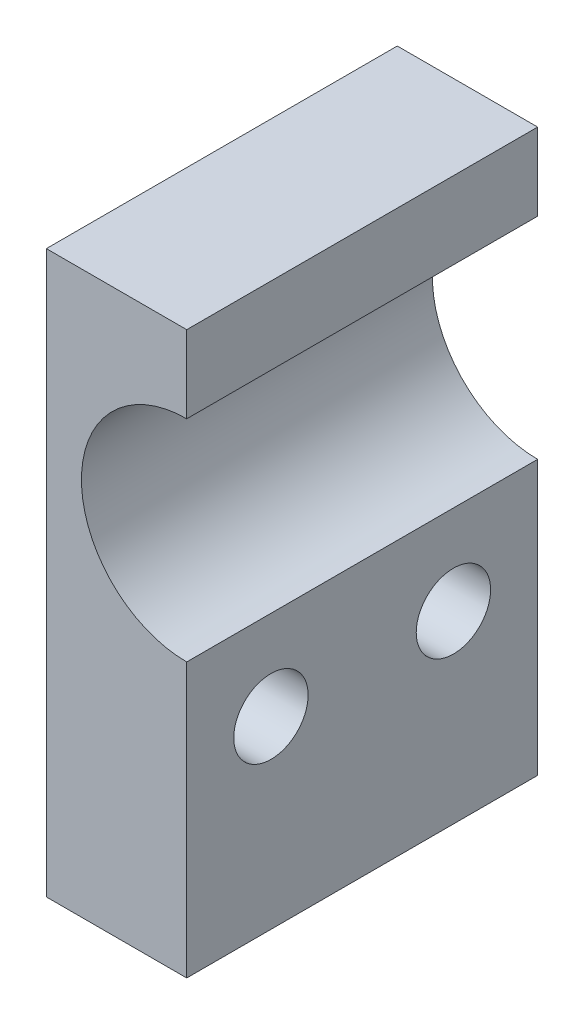
ISO-10303-21;
HEADER;
FILE_DESCRIPTION(('STEP AP214'),'2;1');
FILE_NAME('part.step','',(''),(''),'','','');
FILE_SCHEMA(('AUTOMOTIVE_DESIGN { 1 0 10303 214 1 1 1 1 }'));
ENDSEC;
DATA;
#1=APPLICATION_CONTEXT('core data for automotive mechanical design processes');
#2=APPLICATION_PROTOCOL_DEFINITION('international standard','automotive_design',2000,#1);
#3=PRODUCT_CONTEXT('',#1,'mechanical');
#4=PRODUCT('Part','Part','',(#3));
#5=PRODUCT_RELATED_PRODUCT_CATEGORY('part','',(#4));
#6=PRODUCT_DEFINITION_FORMATION('','',#4);
#7=PRODUCT_DEFINITION_CONTEXT('part definition',#1,'design');
#8=PRODUCT_DEFINITION('design','',#6,#7);
#9=PRODUCT_DEFINITION_SHAPE('','',#8);
#10=(LENGTH_UNIT() NAMED_UNIT(*) SI_UNIT(.MILLI.,.METRE.));
#11=(NAMED_UNIT(*) PLANE_ANGLE_UNIT() SI_UNIT($,.RADIAN.));
#12=(NAMED_UNIT(*) SI_UNIT($,.STERADIAN.) SOLID_ANGLE_UNIT());
#13=UNCERTAINTY_MEASURE_WITH_UNIT(LENGTH_MEASURE(1.E-05),#10,'distance_accuracy_value','');
#14=(GEOMETRIC_REPRESENTATION_CONTEXT(3) GLOBAL_UNCERTAINTY_ASSIGNED_CONTEXT((#13)) GLOBAL_UNIT_ASSIGNED_CONTEXT((#10,
#11,#12)) REPRESENTATION_CONTEXT('',''));
#15=CARTESIAN_POINT('',(0.,0.,0.));
#16=DIRECTION('',(0.,0.,1.));
#17=DIRECTION('',(1.,0.,0.));
#18=AXIS2_PLACEMENT_3D('',#15,#16,#17);
#19=CARTESIAN_POINT('',(-15.,0.,0.));
#20=DIRECTION('',(-1.,0.,0.));
#21=DIRECTION('',(0.,0.,1.));
#22=AXIS2_PLACEMENT_3D('',#19,#20,#21);
#23=PLANE('',#22);
#24=CARTESIAN_POINT('',(-15.,-6.86493963041226,19.));
#25=DIRECTION('',(-1.,0.,0.));
#26=DIRECTION('',(0.,0.,1.));
#27=AXIS2_PLACEMENT_3D('',#24,#25,#26);
#28=CIRCLE('',#27,2.65);
#29=CARTESIAN_POINT('',(-15.,-6.86493963041226,21.65));
#30=VERTEX_POINT('',#29);
#31=EDGE_CURVE('E148',#30,#30,#28,.F.);
#32=ORIENTED_EDGE('',*,*,#31,.F.);
#33=EDGE_LOOP('',(#32));
#34=FACE_BOUND('',#33,.T.);
#35=DIRECTION('',(0.,0.,-1.));
#36=VECTOR('',#35,1.);
#37=CARTESIAN_POINT('',(-15.,-20.,25.));
#38=LINE('',#37,#36);
#39=CARTESIAN_POINT('',(-15.,-20.,25.));
#40=VERTEX_POINT('',#39);
#41=CARTESIAN_POINT('',(-15.,-20.,0.));
#42=VERTEX_POINT('',#41);
#43=EDGE_CURVE('E103',#40,#42,#38,.T.);
#44=ORIENTED_EDGE('',*,*,#43,.T.);
#45=DIRECTION('',(0.,-1.,0.));
#46=VECTOR('',#45,1.);
#47=CARTESIAN_POINT('',(-15.,0.,0.));
#48=LINE('',#47,#46);
#49=CARTESIAN_POINT('',(-15.,-0.499999999999988,0.));
#50=VERTEX_POINT('',#49);
#51=EDGE_CURVE('E144',#50,#42,#48,.T.);
#52=ORIENTED_EDGE('',*,*,#51,.F.);
#53=DIRECTION('',(0.,0.,-1.));
#54=VECTOR('',#53,1.);
#55=CARTESIAN_POINT('',(-15.,-0.499999999999988,25.));
#56=LINE('',#55,#54);
#57=CARTESIAN_POINT('',(-15.,-0.499999999999988,25.));
#58=VERTEX_POINT('',#57);
#59=EDGE_CURVE('E12',#50,#58,#56,.F.);
#60=ORIENTED_EDGE('',*,*,#59,.T.);
#61=DIRECTION('',(0.,-1.,0.));
#62=VECTOR('',#61,1.);
#63=CARTESIAN_POINT('',(-15.,0.,25.));
#64=LINE('',#63,#62);
#65=EDGE_CURVE('E65',#58,#40,#64,.T.);
#66=ORIENTED_EDGE('',*,*,#65,.T.);
#67=EDGE_LOOP('',(#44,#52,#60,#66));
#68=FACE_BOUND('',#67,.T.);
#69=CARTESIAN_POINT('',(-15.,-6.86493963041226,6.));
#70=DIRECTION('',(-1.,0.,0.));
#71=DIRECTION('',(0.,0.,1.));
#72=AXIS2_PLACEMENT_3D('',#69,#70,#71);
#73=CIRCLE('',#72,2.65);
#74=CARTESIAN_POINT('',(-15.,-6.86493963041226,8.65));
#75=VERTEX_POINT('',#74);
#76=EDGE_CURVE('E44',#75,#75,#73,.F.);
#77=ORIENTED_EDGE('',*,*,#76,.F.);
#78=EDGE_LOOP('',(#77));
#79=FACE_BOUND('',#78,.T.);
#80=ADVANCED_FACE('F40',(#34,#68,#79),#23,.F.);
#81=DIRECTION('',(0.,0.,-1.));
#82=VECTOR('',#81,1.);
#83=CARTESIAN_POINT('',(-15.,14.5,25.));
#84=LINE('',#83,#82);
#85=CARTESIAN_POINT('',(-15.,14.5,25.));
#86=VERTEX_POINT('',#85);
#87=CARTESIAN_POINT('',(-15.,14.5,0.));
#88=VERTEX_POINT('',#87);
#89=EDGE_CURVE('E49',#86,#88,#84,.T.);
#90=ORIENTED_EDGE('',*,*,#89,.T.);
#91=CARTESIAN_POINT('',(-15.,20.,0.));
#92=VERTEX_POINT('',#91);
#93=EDGE_CURVE('E146',#92,#88,#48,.T.);
#94=ORIENTED_EDGE('',*,*,#93,.F.);
#95=DIRECTION('',(0.,0.,-1.));
#96=VECTOR('',#95,1.);
#97=CARTESIAN_POINT('',(-15.,20.,25.));
#98=LINE('',#97,#96);
#99=CARTESIAN_POINT('',(-15.,20.,25.));
#100=VERTEX_POINT('',#99);
#101=EDGE_CURVE('E114',#100,#92,#98,.T.);
#102=ORIENTED_EDGE('',*,*,#101,.F.);
#103=EDGE_CURVE('E57',#100,#86,#64,.T.);
#104=ORIENTED_EDGE('',*,*,#103,.T.);
#105=EDGE_LOOP('',(#90,#94,#102,#104));
#106=FACE_BOUND('',#105,.T.);
#107=ADVANCED_FACE('F42',(#106),#23,.F.);
#108=CARTESIAN_POINT('',(-22.,-6.86493963041226,19.));
#109=DIRECTION('',(-1.,0.,0.));
#110=DIRECTION('',(0.,0.,1.));
#111=AXIS2_PLACEMENT_3D('',#108,#109,#110);
#112=CYLINDRICAL_SURFACE('',#111,5.);
#113=CARTESIAN_POINT('',(-22.,-6.86493963041226,19.));
#114=DIRECTION('',(-1.,0.,0.));
#115=DIRECTION('',(0.,0.,1.));
#116=AXIS2_PLACEMENT_3D('',#113,#114,#115);
#117=CIRCLE('',#116,5.);
#118=CARTESIAN_POINT('',(-22.,-6.86493963041226,24.));
#119=VERTEX_POINT('',#118);
#120=EDGE_CURVE('E208',#119,#119,#117,.T.);
#121=ORIENTED_EDGE('',*,*,#120,.F.);
#122=EDGE_LOOP('',(#121));
#123=FACE_BOUND('',#122,.T.);
#124=CARTESIAN_POINT('',(-25.,-6.86493963041226,19.));
#125=DIRECTION('',(-1.,0.,0.));
#126=DIRECTION('',(0.,0.,1.));
#127=AXIS2_PLACEMENT_3D('',#124,#125,#126);
#128=CIRCLE('',#127,5.);
#129=CARTESIAN_POINT('',(-25.,-6.86493963041226,24.));
#130=VERTEX_POINT('',#129);
#131=EDGE_CURVE('E206',#130,#130,#128,.T.);
#132=ORIENTED_EDGE('',*,*,#131,.T.);
#133=EDGE_LOOP('',(#132));
#134=FACE_BOUND('',#133,.T.);
#135=ADVANCED_FACE('F165',(#123,#134),#112,.F.);
#136=CARTESIAN_POINT('',(-22.,-6.86493963041226,6.));
#137=DIRECTION('',(-1.,0.,0.));
#138=DIRECTION('',(0.,0.,1.));
#139=AXIS2_PLACEMENT_3D('',#136,#137,#138);
#140=CYLINDRICAL_SURFACE('',#139,5.);
#141=CARTESIAN_POINT('',(-22.,-6.86493963041226,6.));
#142=DIRECTION('',(-1.,0.,0.));
#143=DIRECTION('',(0.,0.,1.));
#144=AXIS2_PLACEMENT_3D('',#141,#142,#143);
#145=CIRCLE('',#144,5.);
#146=CARTESIAN_POINT('',(-22.,-6.86493963041226,11.));
#147=VERTEX_POINT('',#146);
#148=EDGE_CURVE('E140',#147,#147,#145,.T.);
#149=ORIENTED_EDGE('',*,*,#148,.F.);
#150=EDGE_LOOP('',(#149));
#151=FACE_BOUND('',#150,.T.);
#152=CARTESIAN_POINT('',(-25.,-6.86493963041226,6.));
#153=DIRECTION('',(-1.,0.,0.));
#154=DIRECTION('',(0.,0.,1.));
#155=AXIS2_PLACEMENT_3D('',#152,#153,#154);
#156=CIRCLE('',#155,5.);
#157=CARTESIAN_POINT('',(-25.,-6.86493963041226,11.));
#158=VERTEX_POINT('',#157);
#159=EDGE_CURVE('E203',#158,#158,#156,.T.);
#160=ORIENTED_EDGE('',*,*,#159,.T.);
#161=EDGE_LOOP('',(#160));
#162=FACE_BOUND('',#161,.T.);
#163=ADVANCED_FACE('F190',(#151,#162),#140,.F.);
#164=CARTESIAN_POINT('',(-25.,0.,25.));
#165=DIRECTION('',(-1.,0.,0.));
#166=DIRECTION('',(0.,0.,1.));
#167=AXIS2_PLACEMENT_3D('',#164,#165,#166);
#168=PLANE('',#167);
#169=ORIENTED_EDGE('',*,*,#159,.F.);
#170=EDGE_LOOP('',(#169));
#171=FACE_BOUND('',#170,.T.);
#172=ORIENTED_EDGE('',*,*,#131,.F.);
#173=EDGE_LOOP('',(#172));
#174=FACE_BOUND('',#173,.T.);
#175=DIRECTION('',(0.,1.,0.));
#176=VECTOR('',#175,1.);
#177=CARTESIAN_POINT('',(-25.,0.,0.));
#178=LINE('',#177,#176);
#179=CARTESIAN_POINT('',(-25.,-20.,0.));
#180=VERTEX_POINT('',#179);
#181=CARTESIAN_POINT('',(-25.,20.,0.));
#182=VERTEX_POINT('',#181);
#183=EDGE_CURVE('E113',#180,#182,#178,.T.);
#184=ORIENTED_EDGE('',*,*,#183,.F.);
#185=DIRECTION('',(0.,0.,-1.));
#186=VECTOR('',#185,1.);
#187=CARTESIAN_POINT('',(-25.,-20.,25.));
#188=LINE('',#187,#186);
#189=CARTESIAN_POINT('',(-25.,-20.,25.));
#190=VERTEX_POINT('',#189);
#191=EDGE_CURVE('E100',#190,#180,#188,.T.);
#192=ORIENTED_EDGE('',*,*,#191,.F.);
#193=DIRECTION('',(0.,1.,0.));
#194=VECTOR('',#193,1.);
#195=CARTESIAN_POINT('',(-25.,0.,25.));
#196=LINE('',#195,#194);
#197=CARTESIAN_POINT('',(-25.,20.,25.));
#198=VERTEX_POINT('',#197);
#199=EDGE_CURVE('E106',#190,#198,#196,.T.);
#200=ORIENTED_EDGE('',*,*,#199,.T.);
#201=DIRECTION('',(0.,0.,-1.));
#202=VECTOR('',#201,1.);
#203=CARTESIAN_POINT('',(-25.,20.,25.));
#204=LINE('',#203,#202);
#205=EDGE_CURVE('E115',#198,#182,#204,.T.);
#206=ORIENTED_EDGE('',*,*,#205,.T.);
#207=EDGE_LOOP('',(#184,#192,#200,#206));
#208=FACE_BOUND('',#207,.T.);
#209=ADVANCED_FACE('F110',(#171,#174,#208),#168,.T.);
#210=CARTESIAN_POINT('',(0.,0.,0.));
#211=DIRECTION('',(0.,0.,1.));
#212=DIRECTION('',(1.,0.,0.));
#213=AXIS2_PLACEMENT_3D('',#210,#211,#212);
#214=PLANE('',#213);
#215=DIRECTION('',(-1.,0.,0.));
#216=VECTOR('',#215,1.);
#217=CARTESIAN_POINT('',(0.,20.,0.));
#218=LINE('',#217,#216);
#219=EDGE_CURVE('E123',#92,#182,#218,.T.);
#220=ORIENTED_EDGE('',*,*,#219,.F.);
#221=ORIENTED_EDGE('',*,*,#93,.T.);
#222=CARTESIAN_POINT('',(-15.,7.00000000000001,0.));
#223=DIRECTION('',(0.,0.,1.));
#224=DIRECTION('',(1.,0.,0.));
#225=AXIS2_PLACEMENT_3D('',#222,#223,#224);
#226=CIRCLE('',#225,7.5);
#227=EDGE_CURVE('E128',#88,#50,#226,.T.);
#228=ORIENTED_EDGE('',*,*,#227,.T.);
#229=ORIENTED_EDGE('',*,*,#51,.T.);
#230=DIRECTION('',(-1.,0.,0.));
#231=VECTOR('',#230,1.);
#232=CARTESIAN_POINT('',(0.,-20.,0.));
#233=LINE('',#232,#231);
#234=EDGE_CURVE('E133',#42,#180,#233,.T.);
#235=ORIENTED_EDGE('',*,*,#234,.T.);
#236=ORIENTED_EDGE('',*,*,#183,.T.);
#237=EDGE_LOOP('',(#220,#221,#228,#229,#235,#236));
#238=FACE_BOUND('',#237,.T.);
#239=ADVANCED_FACE('F170',(#238),#214,.F.);
#240=CARTESIAN_POINT('',(0.,0.,25.));
#241=DIRECTION('',(0.,0.,1.));
#242=DIRECTION('',(1.,0.,0.));
#243=AXIS2_PLACEMENT_3D('',#240,#241,#242);
#244=PLANE('',#243);
#245=ORIENTED_EDGE('',*,*,#103,.F.);
#246=DIRECTION('',(-1.,0.,0.));
#247=VECTOR('',#246,1.);
#248=CARTESIAN_POINT('',(0.,20.,25.));
#249=LINE('',#248,#247);
#250=EDGE_CURVE('E105',#100,#198,#249,.T.);
#251=ORIENTED_EDGE('',*,*,#250,.T.);
#252=ORIENTED_EDGE('',*,*,#199,.F.);
#253=DIRECTION('',(-1.,0.,0.));
#254=VECTOR('',#253,1.);
#255=CARTESIAN_POINT('',(0.,-20.,25.));
#256=LINE('',#255,#254);
#257=EDGE_CURVE('E96',#40,#190,#256,.T.);
#258=ORIENTED_EDGE('',*,*,#257,.F.);
#259=ORIENTED_EDGE('',*,*,#65,.F.);
#260=CARTESIAN_POINT('',(-15.,7.00000000000001,25.));
#261=DIRECTION('',(0.,0.,1.));
#262=DIRECTION('',(1.,0.,0.));
#263=AXIS2_PLACEMENT_3D('',#260,#261,#262);
#264=CIRCLE('',#263,7.5);
#265=EDGE_CURVE('E120',#86,#58,#264,.T.);
#266=ORIENTED_EDGE('',*,*,#265,.F.);
#267=EDGE_LOOP('',(#245,#251,#252,#258,#259,#266));
#268=FACE_BOUND('',#267,.T.);
#269=ADVANCED_FACE('F117',(#268),#244,.T.);
#270=CARTESIAN_POINT('',(0.,20.,25.));
#271=DIRECTION('',(0.,-1.,0.));
#272=DIRECTION('',(1.,0.,0.));
#273=AXIS2_PLACEMENT_3D('',#270,#271,#272);
#274=PLANE('',#273);
#275=ORIENTED_EDGE('',*,*,#250,.F.);
#276=ORIENTED_EDGE('',*,*,#101,.T.);
#277=ORIENTED_EDGE('',*,*,#219,.T.);
#278=ORIENTED_EDGE('',*,*,#205,.F.);
#279=EDGE_LOOP('',(#275,#276,#277,#278));
#280=FACE_BOUND('',#279,.T.);
#281=ADVANCED_FACE('F176',(#280),#274,.F.);
#282=CARTESIAN_POINT('',(-15.,7.00000000000001,25.));
#283=DIRECTION('',(0.,0.,-1.));
#284=DIRECTION('',(-1.,0.,0.));
#285=AXIS2_PLACEMENT_3D('',#282,#283,#284);
#286=CYLINDRICAL_SURFACE('',#285,7.5);
#287=ORIENTED_EDGE('',*,*,#89,.F.);
#288=ORIENTED_EDGE('',*,*,#265,.T.);
#289=ORIENTED_EDGE('',*,*,#59,.F.);
#290=ORIENTED_EDGE('',*,*,#227,.F.);
#291=EDGE_LOOP('',(#287,#288,#289,#290));
#292=FACE_BOUND('',#291,.T.);
#293=ADVANCED_FACE('F174',(#292),#286,.F.);
#294=CARTESIAN_POINT('',(0.,-20.,25.));
#295=DIRECTION('',(0.,-1.,0.));
#296=DIRECTION('',(1.,0.,0.));
#297=AXIS2_PLACEMENT_3D('',#294,#295,#296);
#298=PLANE('',#297);
#299=ORIENTED_EDGE('',*,*,#43,.F.);
#300=ORIENTED_EDGE('',*,*,#257,.T.);
#301=ORIENTED_EDGE('',*,*,#191,.T.);
#302=ORIENTED_EDGE('',*,*,#234,.F.);
#303=EDGE_LOOP('',(#299,#300,#301,#302));
#304=FACE_BOUND('',#303,.T.);
#305=ADVANCED_FACE('F98',(#304),#298,.T.);
#306=CARTESIAN_POINT('',(-22.,-6.86493963041226,19.));
#307=DIRECTION('',(-1.,0.,0.));
#308=DIRECTION('',(0.,0.,1.));
#309=AXIS2_PLACEMENT_3D('',#306,#307,#308);
#310=PLANE('',#309);
#311=ORIENTED_EDGE('',*,*,#120,.T.);
#312=EDGE_LOOP('',(#311));
#313=FACE_BOUND('',#312,.T.);
#314=CARTESIAN_POINT('',(-22.,-6.86493963041226,19.));
#315=DIRECTION('',(-1.,0.,0.));
#316=DIRECTION('',(0.,0.,1.));
#317=AXIS2_PLACEMENT_3D('',#314,#315,#316);
#318=CIRCLE('',#317,2.65);
#319=CARTESIAN_POINT('',(-22.,-6.86493963041226,21.65));
#320=VERTEX_POINT('',#319);
#321=EDGE_CURVE('E137',#320,#320,#318,.F.);
#322=ORIENTED_EDGE('',*,*,#321,.T.);
#323=EDGE_LOOP('',(#322));
#324=FACE_BOUND('',#323,.T.);
#325=ADVANCED_FACE('F188',(#313,#324),#310,.T.);
#326=CARTESIAN_POINT('',(-5.,-6.86493963041226,19.));
#327=DIRECTION('',(-1.,0.,0.));
#328=DIRECTION('',(0.,0.,1.));
#329=AXIS2_PLACEMENT_3D('',#326,#327,#328);
#330=CYLINDRICAL_SURFACE('',#329,2.65);
#331=ORIENTED_EDGE('',*,*,#31,.T.);
#332=EDGE_LOOP('',(#331));
#333=FACE_BOUND('',#332,.T.);
#334=ORIENTED_EDGE('',*,*,#321,.F.);
#335=EDGE_LOOP('',(#334));
#336=FACE_BOUND('',#335,.T.);
#337=ADVANCED_FACE('F220',(#333,#336),#330,.F.);
#338=CARTESIAN_POINT('',(-22.,-6.86493963041226,6.));
#339=DIRECTION('',(-1.,0.,0.));
#340=DIRECTION('',(0.,0.,1.));
#341=AXIS2_PLACEMENT_3D('',#338,#339,#340);
#342=PLANE('',#341);
#343=ORIENTED_EDGE('',*,*,#148,.T.);
#344=EDGE_LOOP('',(#343));
#345=FACE_BOUND('',#344,.T.);
#346=CARTESIAN_POINT('',(-22.,-6.86493963041226,6.));
#347=DIRECTION('',(-1.,0.,0.));
#348=DIRECTION('',(0.,0.,1.));
#349=AXIS2_PLACEMENT_3D('',#346,#347,#348);
#350=CIRCLE('',#349,2.65);
#351=CARTESIAN_POINT('',(-22.,-6.86493963041226,8.65));
#352=VERTEX_POINT('',#351);
#353=EDGE_CURVE('E131',#352,#352,#350,.F.);
#354=ORIENTED_EDGE('',*,*,#353,.T.);
#355=EDGE_LOOP('',(#354));
#356=FACE_BOUND('',#355,.T.);
#357=ADVANCED_FACE('F216',(#345,#356),#342,.T.);
#358=CARTESIAN_POINT('',(-5.,-6.86493963041226,6.));
#359=DIRECTION('',(-1.,0.,0.));
#360=DIRECTION('',(0.,0.,1.));
#361=AXIS2_PLACEMENT_3D('',#358,#359,#360);
#362=CYLINDRICAL_SURFACE('',#361,2.65);
#363=ORIENTED_EDGE('',*,*,#76,.T.);
#364=EDGE_LOOP('',(#363));
#365=FACE_BOUND('',#364,.T.);
#366=ORIENTED_EDGE('',*,*,#353,.F.);
#367=EDGE_LOOP('',(#366));
#368=FACE_BOUND('',#367,.T.);
#369=ADVANCED_FACE('F156',(#365,#368),#362,.F.);
#370=CLOSED_SHELL('',(#80,#107,#135,#163,#209,#239,#269,#281,#293,#305,#325,#337,#357,#369));
#371=MANIFOLD_SOLID_BREP('B2',#370);
#372=ADVANCED_BREP_SHAPE_REPRESENTATION('',(#18,#371),#14);
#373=SHAPE_DEFINITION_REPRESENTATION(#9,#372);
ENDSEC;
END-ISO-10303-21;
